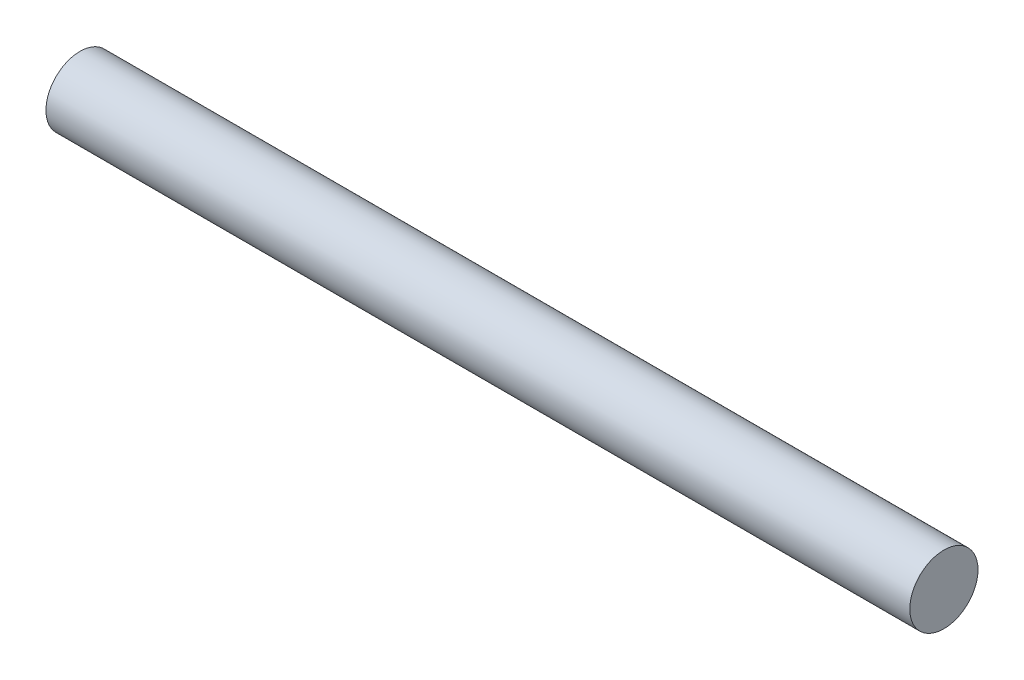
ISO-10303-21;
HEADER;
FILE_DESCRIPTION(('STEP AP214'),'2;1');
FILE_NAME('part.step','',(''),(''),'','','');
FILE_SCHEMA(('AUTOMOTIVE_DESIGN { 1 0 10303 214 1 1 1 1 }'));
ENDSEC;
DATA;
#1=APPLICATION_CONTEXT('core data for automotive mechanical design processes');
#2=APPLICATION_PROTOCOL_DEFINITION('international standard','automotive_design',2000,#1);
#3=PRODUCT_CONTEXT('',#1,'mechanical');
#4=PRODUCT('Part','Part','',(#3));
#5=PRODUCT_RELATED_PRODUCT_CATEGORY('part','',(#4));
#6=PRODUCT_DEFINITION_FORMATION('','',#4);
#7=PRODUCT_DEFINITION_CONTEXT('part definition',#1,'design');
#8=PRODUCT_DEFINITION('design','',#6,#7);
#9=PRODUCT_DEFINITION_SHAPE('','',#8);
#10=(LENGTH_UNIT() NAMED_UNIT(*) SI_UNIT(.MILLI.,.METRE.));
#11=(NAMED_UNIT(*) PLANE_ANGLE_UNIT() SI_UNIT($,.RADIAN.));
#12=(NAMED_UNIT(*) SI_UNIT($,.STERADIAN.) SOLID_ANGLE_UNIT());
#13=UNCERTAINTY_MEASURE_WITH_UNIT(LENGTH_MEASURE(1.E-05),#10,'distance_accuracy_value','');
#14=(GEOMETRIC_REPRESENTATION_CONTEXT(3) GLOBAL_UNCERTAINTY_ASSIGNED_CONTEXT((#13)) GLOBAL_UNIT_ASSIGNED_CONTEXT((#10,
#11,#12)) REPRESENTATION_CONTEXT('',''));
#15=CARTESIAN_POINT('',(0.,0.,0.));
#16=DIRECTION('',(0.,0.,1.));
#17=DIRECTION('',(1.,0.,0.));
#18=AXIS2_PLACEMENT_3D('',#15,#16,#17);
#19=CARTESIAN_POINT('',(120.65,0.,0.));
#20=DIRECTION('',(-1.,0.,0.));
#21=DIRECTION('',(0.,0.,-1.));
#22=AXIS2_PLACEMENT_3D('',#19,#20,#21);
#23=CYLINDRICAL_SURFACE('',#22,4.7625);
#24=CARTESIAN_POINT('',(120.65,0.,0.));
#25=DIRECTION('',(-1.,0.,0.));
#26=DIRECTION('',(0.,0.,1.));
#27=AXIS2_PLACEMENT_3D('',#24,#25,#26);
#28=CIRCLE('',#27,4.7625);
#29=CARTESIAN_POINT('',(120.65,0.,-4.7625));
#30=VERTEX_POINT('',#29);
#31=EDGE_CURVE('E10',#30,#30,#28,.T.);
#32=CARTESIAN_POINT('',(0.,0.,0.));
#33=DIRECTION('',(-1.,0.,0.));
#34=DIRECTION('',(0.,0.,1.));
#35=AXIS2_PLACEMENT_3D('',#32,#33,#34);
#36=CIRCLE('',#35,4.7625);
#37=CARTESIAN_POINT('',(0.,0.,-4.7625));
#38=VERTEX_POINT('',#37);
#39=EDGE_CURVE('E34',#38,#38,#36,.T.);
#40=CARTESIAN_POINT('',(120.65,0.,-4.7625));
#41=CARTESIAN_POINT('',(119.393229166667,0.,-4.7625));
#42=CARTESIAN_POINT('',(118.136458333333,0.,-4.7625));
#43=CARTESIAN_POINT('',(115.622916666667,0.,-4.7625));
#44=CARTESIAN_POINT('',(114.366145833333,0.,-4.7625));
#45=CARTESIAN_POINT('',(111.852604166667,0.,-4.7625));
#46=CARTESIAN_POINT('',(110.595833333333,0.,-4.7625));
#47=CARTESIAN_POINT('',(108.082291666667,0.,-4.7625));
#48=CARTESIAN_POINT('',(106.825520833333,0.,-4.7625));
#49=CARTESIAN_POINT('',(104.311979166667,0.,-4.7625));
#50=CARTESIAN_POINT('',(103.055208333333,0.,-4.7625));
#51=CARTESIAN_POINT('',(100.541666666667,0.,-4.7625));
#52=CARTESIAN_POINT('',(99.2848958333333,0.,-4.7625));
#53=CARTESIAN_POINT('',(96.7713541666667,0.,-4.7625));
#54=CARTESIAN_POINT('',(95.5145833333333,0.,-4.7625));
#55=CARTESIAN_POINT('',(93.0010416666667,0.,-4.7625));
#56=CARTESIAN_POINT('',(91.7442708333333,0.,-4.7625));
#57=CARTESIAN_POINT('',(89.2307291666667,0.,-4.7625));
#58=CARTESIAN_POINT('',(87.9739583333333,0.,-4.7625));
#59=CARTESIAN_POINT('',(85.4604166666667,0.,-4.7625));
#60=CARTESIAN_POINT('',(84.2036458333333,0.,-4.7625));
#61=CARTESIAN_POINT('',(81.6901041666667,0.,-4.7625));
#62=CARTESIAN_POINT('',(80.4333333333333,0.,-4.7625));
#63=CARTESIAN_POINT('',(77.9197916666667,0.,-4.7625));
#64=CARTESIAN_POINT('',(76.6630208333333,0.,-4.7625));
#65=CARTESIAN_POINT('',(74.1494791666667,0.,-4.7625));
#66=CARTESIAN_POINT('',(72.8927083333333,0.,-4.7625));
#67=CARTESIAN_POINT('',(70.3791666666667,0.,-4.7625));
#68=CARTESIAN_POINT('',(69.1223958333333,0.,-4.7625));
#69=CARTESIAN_POINT('',(66.6088541666667,0.,-4.7625));
#70=CARTESIAN_POINT('',(65.3520833333333,0.,-4.7625));
#71=CARTESIAN_POINT('',(62.8385416666667,0.,-4.7625));
#72=CARTESIAN_POINT('',(61.5817708333333,0.,-4.7625));
#73=CARTESIAN_POINT('',(59.0682291666667,0.,-4.7625));
#74=CARTESIAN_POINT('',(57.8114583333333,0.,-4.7625));
#75=CARTESIAN_POINT('',(55.2979166666667,0.,-4.7625));
#76=CARTESIAN_POINT('',(54.0411458333333,0.,-4.7625));
#77=CARTESIAN_POINT('',(51.5276041666667,0.,-4.7625));
#78=CARTESIAN_POINT('',(50.2708333333333,0.,-4.7625));
#79=CARTESIAN_POINT('',(47.7572916666667,0.,-4.7625));
#80=CARTESIAN_POINT('',(46.5005208333333,0.,-4.7625));
#81=CARTESIAN_POINT('',(43.9869791666667,0.,-4.7625));
#82=CARTESIAN_POINT('',(42.7302083333333,0.,-4.7625));
#83=CARTESIAN_POINT('',(40.2166666666667,0.,-4.7625));
#84=CARTESIAN_POINT('',(38.9598958333333,0.,-4.7625));
#85=CARTESIAN_POINT('',(36.4463541666667,0.,-4.7625));
#86=CARTESIAN_POINT('',(35.1895833333333,0.,-4.7625));
#87=CARTESIAN_POINT('',(32.6760416666667,0.,-4.7625));
#88=CARTESIAN_POINT('',(31.4192708333333,0.,-4.7625));
#89=CARTESIAN_POINT('',(28.9057291666667,0.,-4.7625));
#90=CARTESIAN_POINT('',(27.6489583333333,0.,-4.7625));
#91=CARTESIAN_POINT('',(25.1354166666667,0.,-4.7625));
#92=CARTESIAN_POINT('',(23.8786458333333,0.,-4.7625));
#93=CARTESIAN_POINT('',(21.3651041666667,0.,-4.7625));
#94=CARTESIAN_POINT('',(20.1083333333333,0.,-4.7625));
#95=CARTESIAN_POINT('',(17.5947916666667,0.,-4.7625));
#96=CARTESIAN_POINT('',(16.3380208333333,0.,-4.7625));
#97=CARTESIAN_POINT('',(13.8244791666667,0.,-4.7625));
#98=CARTESIAN_POINT('',(12.5677083333333,0.,-4.7625));
#99=CARTESIAN_POINT('',(10.0541666666667,0.,-4.7625));
#100=CARTESIAN_POINT('',(8.79739583333333,0.,-4.7625));
#101=CARTESIAN_POINT('',(6.28385416666666,0.,-4.7625));
#102=CARTESIAN_POINT('',(5.02708333333333,0.,-4.7625));
#103=CARTESIAN_POINT('',(2.51354166666666,0.,-4.7625));
#104=CARTESIAN_POINT('',(1.25677083333333,0.,-4.7625));
#105=CARTESIAN_POINT('',(0.,0.,-4.7625));
#106=B_SPLINE_CURVE_WITH_KNOTS('',3,(#40,#41,#42,#43,#44,#45,#46,#47,#48,#49,#50,#51,#52,#53,
#54,#55,#56,#57,#58,#59,#60,#61,#62,#63,#64,#65,#66,#67,#68,#69,#70,#71,#72,#73,#74,#75,#76,#77,
#78,#79,#80,#81,#82,#83,#84,#85,#86,#87,#88,#89,#90,#91,#92,#93,#94,#95,#96,#97,#98,#99,#100,
#101,#102,#103,#104,#105),.UNSPECIFIED.,.F.,.F.,(4,2,2,2,2,2,2,2,2,2,2,2,2,2,2,2,2,2,2,2,2,2,2,
2,2,2,2,2,2,2,2,2,4),(0.,3.77031250000001,7.54062500000001,11.3109375,15.08125,18.8515625,
22.621875,26.3921875,30.1625,33.9328125,37.703125,41.4734375,45.24375,49.0140625,52.784375,
56.5546875,60.325,64.0953125,67.865625,71.6359375,75.40625,79.1765625,82.946875,86.7171875,
90.4875,94.2578125,98.028125,101.7984375,105.56875,109.3390625,113.109375,116.8796875,120.65),.UNSPECIFIED.);
#107=EDGE_CURVE('BSEAM31',#30,#38,#106,.T.);
#108=ORIENTED_EDGE('',*,*,#31,.T.);
#109=ORIENTED_EDGE('',*,*,#39,.F.);
#110=ORIENTED_EDGE('',*,*,#107,.T.);
#111=ORIENTED_EDGE('',*,*,#107,.F.);
#112=EDGE_LOOP('',(#108,#110,#109,#111));
#113=FACE_BOUND('',#112,.T.);
#114=ADVANCED_FACE('F31',(#113),#23,.T.);
#115=CARTESIAN_POINT('',(120.65,0.,0.));
#116=DIRECTION('',(1.,0.,0.));
#117=DIRECTION('',(0.,0.,1.));
#118=AXIS2_PLACEMENT_3D('',#115,#116,#117);
#119=PLANE('',#118);
#120=ORIENTED_EDGE('',*,*,#31,.F.);
#121=EDGE_LOOP('',(#120));
#122=FACE_BOUND('',#121,.T.);
#123=ADVANCED_FACE('F46',(#122),#119,.T.);
#124=CARTESIAN_POINT('',(0.,0.,0.));
#125=DIRECTION('',(1.,0.,0.));
#126=DIRECTION('',(0.,0.,1.));
#127=AXIS2_PLACEMENT_3D('',#124,#125,#126);
#128=PLANE('',#127);
#129=ORIENTED_EDGE('',*,*,#39,.T.);
#130=EDGE_LOOP('',(#129));
#131=FACE_BOUND('',#130,.T.);
#132=ADVANCED_FACE('F43',(#131),#128,.F.);
#133=CLOSED_SHELL('',(#114,#123,#132));
#134=MANIFOLD_SOLID_BREP('B2',#133);
#135=ADVANCED_BREP_SHAPE_REPRESENTATION('',(#18,#134),#14);
#136=SHAPE_DEFINITION_REPRESENTATION(#9,#135);
ENDSEC;
END-ISO-10303-21;
